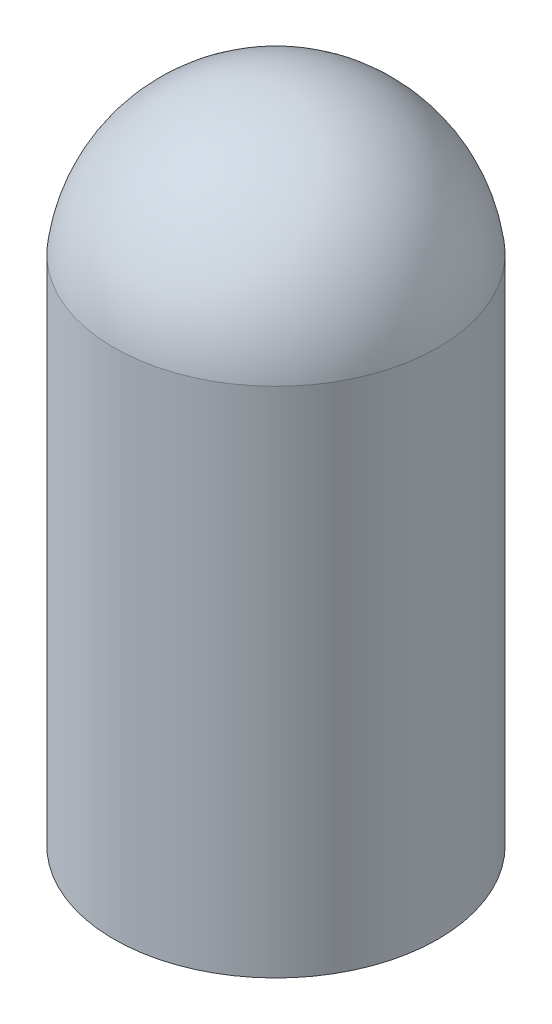
ISO-10303-21;
HEADER;
FILE_DESCRIPTION(('STEP AP214'),'2;1');
FILE_NAME('part.step','',(''),(''),'','','');
FILE_SCHEMA(('AUTOMOTIVE_DESIGN { 1 0 10303 214 1 1 1 1 }'));
ENDSEC;
DATA;
#1=APPLICATION_CONTEXT('core data for automotive mechanical design processes');
#2=APPLICATION_PROTOCOL_DEFINITION('international standard','automotive_design',2000,#1);
#3=PRODUCT_CONTEXT('',#1,'mechanical');
#4=PRODUCT('Part','Part','',(#3));
#5=PRODUCT_RELATED_PRODUCT_CATEGORY('part','',(#4));
#6=PRODUCT_DEFINITION_FORMATION('','',#4);
#7=PRODUCT_DEFINITION_CONTEXT('part definition',#1,'design');
#8=PRODUCT_DEFINITION('design','',#6,#7);
#9=PRODUCT_DEFINITION_SHAPE('','',#8);
#10=(LENGTH_UNIT() NAMED_UNIT(*) SI_UNIT(.MILLI.,.METRE.));
#11=(NAMED_UNIT(*) PLANE_ANGLE_UNIT() SI_UNIT($,.RADIAN.));
#12=(NAMED_UNIT(*) SI_UNIT($,.STERADIAN.) SOLID_ANGLE_UNIT());
#13=UNCERTAINTY_MEASURE_WITH_UNIT(LENGTH_MEASURE(1.E-05),#10,'distance_accuracy_value','');
#14=(GEOMETRIC_REPRESENTATION_CONTEXT(3) GLOBAL_UNCERTAINTY_ASSIGNED_CONTEXT((#13)) GLOBAL_UNIT_ASSIGNED_CONTEXT((#10,
#11,#12)) REPRESENTATION_CONTEXT('',''));
#15=CARTESIAN_POINT('',(0.,0.,0.));
#16=DIRECTION('',(0.,0.,1.));
#17=DIRECTION('',(1.,0.,0.));
#18=AXIS2_PLACEMENT_3D('',#15,#16,#17);
#19=CARTESIAN_POINT('',(-39.6875,0.,0.));
#20=DIRECTION('',(0.,1.,0.));
#21=DIRECTION('',(-1.,0.,0.));
#22=AXIS2_PLACEMENT_3D('',#19,#20,#21);
#23=PLANE('',#22);
#24=CARTESIAN_POINT('',(0.,0.,0.));
#25=DIRECTION('',(0.,-1.,0.));
#26=DIRECTION('',(1.,0.,0.));
#27=AXIS2_PLACEMENT_3D('',#24,#25,#26);
#28=CIRCLE('',#27,35.8775);
#29=CARTESIAN_POINT('',(35.8775,0.,0.));
#30=VERTEX_POINT('',#29);
#31=EDGE_CURVE('E55',#30,#30,#28,.T.);
#32=ORIENTED_EDGE('',*,*,#31,.F.);
#33=EDGE_LOOP('',(#32));
#34=FACE_BOUND('',#33,.T.);
#35=CARTESIAN_POINT('',(0.,0.,0.));
#36=DIRECTION('',(0.,-1.,0.));
#37=DIRECTION('',(1.,0.,0.));
#38=AXIS2_PLACEMENT_3D('',#35,#36,#37);
#39=CIRCLE('',#38,39.6875);
#40=CARTESIAN_POINT('',(39.6875,0.,0.));
#41=VERTEX_POINT('',#40);
#42=EDGE_CURVE('E10',#41,#41,#39,.T.);
#43=ORIENTED_EDGE('',*,*,#42,.T.);
#44=EDGE_LOOP('',(#43));
#45=FACE_BOUND('',#44,.T.);
#46=ADVANCED_FACE('F39',(#34,#45),#23,.F.);
#47=CARTESIAN_POINT('',(0.,0.,0.));
#48=DIRECTION('',(0.,-1.,0.));
#49=DIRECTION('',(1.,0.,0.));
#50=AXIS2_PLACEMENT_3D('',#47,#48,#49);
#51=CYLINDRICAL_SURFACE('',#50,39.6875);
#52=ORIENTED_EDGE('',*,*,#42,.F.);
#53=EDGE_LOOP('',(#52));
#54=FACE_BOUND('',#53,.T.);
#55=CARTESIAN_POINT('',(0.,125.476,0.));
#56=DIRECTION('',(0.,-1.,0.));
#57=DIRECTION('',(1.,0.,0.));
#58=AXIS2_PLACEMENT_3D('',#55,#56,#57);
#59=CIRCLE('',#58,39.6875);
#60=CARTESIAN_POINT('',(39.6875,125.476,0.));
#61=VERTEX_POINT('',#60);
#62=EDGE_CURVE('E45',#61,#61,#59,.T.);
#63=ORIENTED_EDGE('',*,*,#62,.T.);
#64=EDGE_LOOP('',(#63));
#65=FACE_BOUND('',#64,.T.);
#66=ADVANCED_FACE('F64',(#54,#65),#51,.T.);
#67=CARTESIAN_POINT('',(0.,120.65,0.));
#68=DIRECTION('',(0.,-1.,0.));
#69=DIRECTION('',(1.,0.,0.));
#70=AXIS2_PLACEMENT_3D('',#67,#68,#69);
#71=SPHERICAL_SURFACE('',#70,39.9798440748585);
#72=ORIENTED_EDGE('',*,*,#62,.F.);
#73=EDGE_LOOP('',(#72));
#74=FACE_BOUND('',#73,.T.);
#75=ADVANCED_FACE('F68',(#74),#71,.T.);
#76=CARTESIAN_POINT('',(0.,120.65,0.));
#77=DIRECTION('',(0.,-1.,0.));
#78=DIRECTION('',(-1.,0.,0.));
#79=AXIS2_PLACEMENT_3D('',#76,#77,#78);
#80=SPHERICAL_SURFACE('',#79,36.1698440748585);
#81=CARTESIAN_POINT('',(0.,125.239402373902,0.));
#82=DIRECTION('',(0.,-1.,0.));
#83=DIRECTION('',(1.,0.,0.));
#84=AXIS2_PLACEMENT_3D('',#81,#82,#83);
#85=CIRCLE('',#84,35.8775);
#86=CARTESIAN_POINT('',(35.8775,125.239402373902,0.));
#87=VERTEX_POINT('',#86);
#88=EDGE_CURVE('E50',#87,#87,#85,.T.);
#89=ORIENTED_EDGE('',*,*,#88,.T.);
#90=EDGE_LOOP('',(#89));
#91=FACE_BOUND('',#90,.T.);
#92=ADVANCED_FACE('F73',(#91),#80,.F.);
#93=CARTESIAN_POINT('',(0.,0.,0.));
#94=DIRECTION('',(0.,-1.,0.));
#95=DIRECTION('',(1.,0.,0.));
#96=AXIS2_PLACEMENT_3D('',#93,#94,#95);
#97=CYLINDRICAL_SURFACE('',#96,35.8775);
#98=ORIENTED_EDGE('',*,*,#88,.F.);
#99=EDGE_LOOP('',(#98));
#100=FACE_BOUND('',#99,.T.);
#101=ORIENTED_EDGE('',*,*,#31,.T.);
#102=EDGE_LOOP('',(#101));
#103=FACE_BOUND('',#102,.T.);
#104=ADVANCED_FACE('F61',(#100,#103),#97,.F.);
#105=CLOSED_SHELL('',(#46,#66,#75,#92,#104));
#106=MANIFOLD_SOLID_BREP('B2',#105);
#107=ADVANCED_BREP_SHAPE_REPRESENTATION('',(#18,#106),#14);
#108=SHAPE_DEFINITION_REPRESENTATION(#9,#107);
ENDSEC;
END-ISO-10303-21;
